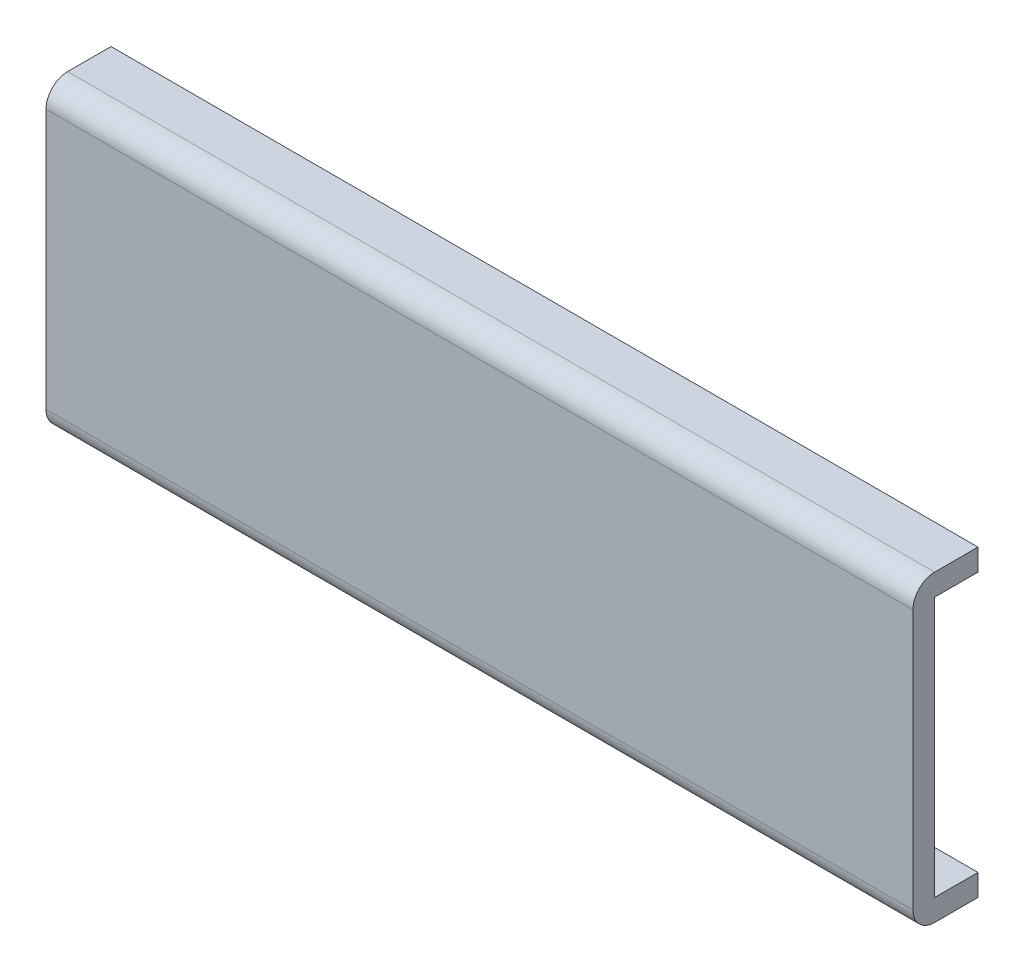
ISO-10303-21;
HEADER;
FILE_DESCRIPTION(('STEP AP214'),'2;1');
FILE_NAME('part.step','',(''),(''),'','','');
FILE_SCHEMA(('AUTOMOTIVE_DESIGN { 1 0 10303 214 1 1 1 1 }'));
ENDSEC;
DATA;
#1=APPLICATION_CONTEXT('core data for automotive mechanical design processes');
#2=APPLICATION_PROTOCOL_DEFINITION('international standard','automotive_design',2000,#1);
#3=PRODUCT_CONTEXT('',#1,'mechanical');
#4=PRODUCT('Part','Part','',(#3));
#5=PRODUCT_RELATED_PRODUCT_CATEGORY('part','',(#4));
#6=PRODUCT_DEFINITION_FORMATION('','',#4);
#7=PRODUCT_DEFINITION_CONTEXT('part definition',#1,'design');
#8=PRODUCT_DEFINITION('design','',#6,#7);
#9=PRODUCT_DEFINITION_SHAPE('','',#8);
#10=(LENGTH_UNIT() NAMED_UNIT(*) SI_UNIT(.MILLI.,.METRE.));
#11=(NAMED_UNIT(*) PLANE_ANGLE_UNIT() SI_UNIT($,.RADIAN.));
#12=(NAMED_UNIT(*) SI_UNIT($,.STERADIAN.) SOLID_ANGLE_UNIT());
#13=UNCERTAINTY_MEASURE_WITH_UNIT(LENGTH_MEASURE(1.E-05),#10,'distance_accuracy_value','');
#14=(GEOMETRIC_REPRESENTATION_CONTEXT(3) GLOBAL_UNCERTAINTY_ASSIGNED_CONTEXT((#13)) GLOBAL_UNIT_ASSIGNED_CONTEXT((#10,
#11,#12)) REPRESENTATION_CONTEXT('',''));
#15=CARTESIAN_POINT('',(0.,0.,0.));
#16=DIRECTION('',(0.,0.,1.));
#17=DIRECTION('',(1.,0.,0.));
#18=AXIS2_PLACEMENT_3D('',#15,#16,#17);
#19=CARTESIAN_POINT('',(30.4772096364507,32.496960400241,-14.9568528181353));
#20=DIRECTION('',(-1.,0.,0.));
#21=DIRECTION('',(0.,0.,1.));
#22=AXIS2_PLACEMENT_3D('',#19,#20,#21);
#23=CYLINDRICAL_SURFACE('',#22,1.);
#24=CARTESIAN_POINT('',(50.4772096364506,32.496960400241,-14.9568528181353));
#25=DIRECTION('',(1.,0.,0.));
#26=DIRECTION('',(0.,1.,0.));
#27=AXIS2_PLACEMENT_3D('',#24,#25,#26);
#28=CIRCLE('',#27,1.);
#29=CARTESIAN_POINT('',(50.4772096364506,33.496960400241,-14.9568528181353));
#30=VERTEX_POINT('',#29);
#31=CARTESIAN_POINT('',(50.4772096364506,32.496960400241,-13.9568528181353));
#32=VERTEX_POINT('',#31);
#33=EDGE_CURVE('E185',#30,#32,#28,.T.);
#34=ORIENTED_EDGE('',*,*,#33,.F.);
#35=DIRECTION('',(1.,0.,0.));
#36=VECTOR('',#35,1.);
#37=CARTESIAN_POINT('',(50.4772096364506,33.496960400241,-14.9568528181353));
#38=LINE('',#37,#36);
#39=CARTESIAN_POINT('',(10.4772096364506,33.496960400241,-14.9568528181353));
#40=VERTEX_POINT('',#39);
#41=EDGE_CURVE('E205',#40,#30,#38,.T.);
#42=ORIENTED_EDGE('',*,*,#41,.F.);
#43=CARTESIAN_POINT('',(10.4772096364506,32.496960400241,-14.9568528181353));
#44=DIRECTION('',(-1.,0.,0.));
#45=DIRECTION('',(0.,0.,1.));
#46=AXIS2_PLACEMENT_3D('',#43,#44,#45);
#47=CIRCLE('',#46,1.);
#48=CARTESIAN_POINT('',(10.4772096364506,32.496960400241,-13.9568528181353));
#49=VERTEX_POINT('',#48);
#50=EDGE_CURVE('E146',#49,#40,#47,.T.);
#51=ORIENTED_EDGE('',*,*,#50,.F.);
#52=DIRECTION('',(-1.,0.,0.));
#53=VECTOR('',#52,1.);
#54=CARTESIAN_POINT('',(50.4772096364506,32.496960400241,-13.9568528181353));
#55=LINE('',#54,#53);
#56=EDGE_CURVE('E137',#32,#49,#55,.T.);
#57=ORIENTED_EDGE('',*,*,#56,.F.);
#58=EDGE_LOOP('',(#34,#42,#51,#57));
#59=FACE_BOUND('',#58,.T.);
#60=ADVANCED_FACE('F17',(#59),#23,.T.);
#61=CARTESIAN_POINT('',(30.4772096364507,20.496960400241,-14.9568528181353));
#62=DIRECTION('',(1.,0.,0.));
#63=DIRECTION('',(0.,0.,-1.));
#64=AXIS2_PLACEMENT_3D('',#61,#62,#63);
#65=CYLINDRICAL_SURFACE('',#64,1.);
#66=CARTESIAN_POINT('',(10.4772096364506,20.496960400241,-14.9568528181353));
#67=DIRECTION('',(-1.,0.,0.));
#68=DIRECTION('',(0.,0.,1.));
#69=AXIS2_PLACEMENT_3D('',#66,#67,#68);
#70=CIRCLE('',#69,1.);
#71=CARTESIAN_POINT('',(10.4772096364506,19.496960400241,-14.9568528181353));
#72=VERTEX_POINT('',#71);
#73=CARTESIAN_POINT('',(10.4772096364506,20.496960400241,-13.9568528181353));
#74=VERTEX_POINT('',#73);
#75=EDGE_CURVE('E122',#72,#74,#70,.T.);
#76=ORIENTED_EDGE('',*,*,#75,.F.);
#77=DIRECTION('',(-1.,0.,0.));
#78=VECTOR('',#77,1.);
#79=CARTESIAN_POINT('',(10.4772096364506,19.496960400241,-14.9568528181353));
#80=LINE('',#79,#78);
#81=CARTESIAN_POINT('',(50.4772096364506,19.496960400241,-14.9568528181353));
#82=VERTEX_POINT('',#81);
#83=EDGE_CURVE('E21',#82,#72,#80,.T.);
#84=ORIENTED_EDGE('',*,*,#83,.F.);
#85=CARTESIAN_POINT('',(50.4772096364506,20.496960400241,-14.9568528181353));
#86=DIRECTION('',(1.,0.,0.));
#87=DIRECTION('',(0.,1.,0.));
#88=AXIS2_PLACEMENT_3D('',#85,#86,#87);
#89=CIRCLE('',#88,1.);
#90=CARTESIAN_POINT('',(50.4772096364506,20.496960400241,-13.9568528181353));
#91=VERTEX_POINT('',#90);
#92=EDGE_CURVE('E134',#91,#82,#89,.T.);
#93=ORIENTED_EDGE('',*,*,#92,.F.);
#94=DIRECTION('',(1.,0.,0.));
#95=VECTOR('',#94,1.);
#96=CARTESIAN_POINT('',(10.4772096364506,20.496960400241,-13.9568528181353));
#97=LINE('',#96,#95);
#98=EDGE_CURVE('E80',#74,#91,#97,.T.);
#99=ORIENTED_EDGE('',*,*,#98,.F.);
#100=EDGE_LOOP('',(#76,#84,#93,#99));
#101=FACE_BOUND('',#100,.T.);
#102=ADVANCED_FACE('F19',(#101),#65,.T.);
#103=CARTESIAN_POINT('',(30.4772096364507,26.496960400241,-16.9568528181352));
#104=DIRECTION('',(0.,0.,1.));
#105=DIRECTION('',(1.,0.,0.));
#106=AXIS2_PLACEMENT_3D('',#103,#104,#105);
#107=PLANE('',#106);
#108=DIRECTION('',(0.,-1.,0.));
#109=VECTOR('',#108,1.);
#110=CARTESIAN_POINT('',(50.4772096364506,20.496960400241,-16.9568528181352));
#111=LINE('',#110,#109);
#112=CARTESIAN_POINT('',(50.4772096364506,20.496960400241,-16.9568528181352));
#113=VERTEX_POINT('',#112);
#114=CARTESIAN_POINT('',(50.4772096364506,19.496960400241,-16.9568528181352));
#115=VERTEX_POINT('',#114);
#116=EDGE_CURVE('E168',#113,#115,#111,.T.);
#117=ORIENTED_EDGE('',*,*,#116,.T.);
#118=DIRECTION('',(-1.,0.,0.));
#119=VECTOR('',#118,1.);
#120=CARTESIAN_POINT('',(50.4772096364506,19.496960400241,-16.9568528181352));
#121=LINE('',#120,#119);
#122=CARTESIAN_POINT('',(10.4772096364506,19.496960400241,-16.9568528181352));
#123=VERTEX_POINT('',#122);
#124=EDGE_CURVE('E153',#115,#123,#121,.T.);
#125=ORIENTED_EDGE('',*,*,#124,.T.);
#126=DIRECTION('',(0.,1.,0.));
#127=VECTOR('',#126,1.);
#128=CARTESIAN_POINT('',(10.4772096364506,19.496960400241,-16.9568528181352));
#129=LINE('',#128,#127);
#130=CARTESIAN_POINT('',(10.4772096364506,20.496960400241,-16.9568528181352));
#131=VERTEX_POINT('',#130);
#132=EDGE_CURVE('E130',#123,#131,#129,.T.);
#133=ORIENTED_EDGE('',*,*,#132,.T.);
#134=DIRECTION('',(1.,0.,0.));
#135=VECTOR('',#134,1.);
#136=CARTESIAN_POINT('',(10.4772096364506,20.496960400241,-16.9568528181352));
#137=LINE('',#136,#135);
#138=EDGE_CURVE('E11',#131,#113,#137,.T.);
#139=ORIENTED_EDGE('',*,*,#138,.T.);
#140=EDGE_LOOP('',(#117,#125,#133,#139));
#141=FACE_BOUND('',#140,.T.);
#142=ADVANCED_FACE('F324',(#141),#107,.F.);
#143=CARTESIAN_POINT('',(50.4772096364506,20.496960400241,-16.9568528181352));
#144=DIRECTION('',(0.,-1.,0.));
#145=DIRECTION('',(0.,0.,-1.));
#146=AXIS2_PLACEMENT_3D('',#143,#144,#145);
#147=PLANE('',#146);
#148=DIRECTION('',(1.,0.,0.));
#149=VECTOR('',#148,1.);
#150=CARTESIAN_POINT('',(10.4772096364506,20.496960400241,-14.9568528181353));
#151=LINE('',#150,#149);
#152=CARTESIAN_POINT('',(10.4772096364506,20.496960400241,-14.9568528181353));
#153=VERTEX_POINT('',#152);
#154=CARTESIAN_POINT('',(50.4772096364506,20.496960400241,-14.9568528181353));
#155=VERTEX_POINT('',#154);
#156=EDGE_CURVE('E197',#153,#155,#151,.T.);
#157=ORIENTED_EDGE('',*,*,#156,.T.);
#158=DIRECTION('',(0.,0.,1.));
#159=VECTOR('',#158,1.);
#160=CARTESIAN_POINT('',(50.4772096364506,20.496960400241,-16.9568528181352));
#161=LINE('',#160,#159);
#162=EDGE_CURVE('E172',#113,#155,#161,.T.);
#163=ORIENTED_EDGE('',*,*,#162,.F.);
#164=ORIENTED_EDGE('',*,*,#138,.F.);
#165=DIRECTION('',(0.,0.,1.));
#166=VECTOR('',#165,1.);
#167=CARTESIAN_POINT('',(10.4772096364506,20.496960400241,-16.9568528181352));
#168=LINE('',#167,#166);
#169=EDGE_CURVE('E162',#131,#153,#168,.T.);
#170=ORIENTED_EDGE('',*,*,#169,.T.);
#171=EDGE_LOOP('',(#157,#163,#164,#170));
#172=FACE_BOUND('',#171,.T.);
#173=ADVANCED_FACE('F329',(#172),#147,.F.);
#174=CARTESIAN_POINT('',(30.4772096364507,26.496960400241,-16.9568528181352));
#175=DIRECTION('',(0.,0.,-1.));
#176=DIRECTION('',(0.,-1.,0.));
#177=AXIS2_PLACEMENT_3D('',#174,#175,#176);
#178=PLANE('',#177);
#179=DIRECTION('',(0.,-1.,0.));
#180=VECTOR('',#179,1.);
#181=CARTESIAN_POINT('',(50.4772096364506,33.496960400241,-16.9568528181352));
#182=LINE('',#181,#180);
#183=CARTESIAN_POINT('',(50.4772096364506,33.496960400241,-16.9568528181352));
#184=VERTEX_POINT('',#183);
#185=CARTESIAN_POINT('',(50.4772096364506,32.496960400241,-16.9568528181352));
#186=VERTEX_POINT('',#185);
#187=EDGE_CURVE('E174',#184,#186,#182,.T.);
#188=ORIENTED_EDGE('',*,*,#187,.T.);
#189=DIRECTION('',(-1.,0.,0.));
#190=VECTOR('',#189,1.);
#191=CARTESIAN_POINT('',(50.4772096364506,32.496960400241,-16.9568528181352));
#192=LINE('',#191,#190);
#193=CARTESIAN_POINT('',(10.4772096364506,32.496960400241,-16.9568528181352));
#194=VERTEX_POINT('',#193);
#195=EDGE_CURVE('E28',#186,#194,#192,.T.);
#196=ORIENTED_EDGE('',*,*,#195,.T.);
#197=DIRECTION('',(0.,1.,0.));
#198=VECTOR('',#197,1.);
#199=CARTESIAN_POINT('',(10.4772096364506,32.496960400241,-16.9568528181352));
#200=LINE('',#199,#198);
#201=CARTESIAN_POINT('',(10.4772096364506,33.496960400241,-16.9568528181352));
#202=VERTEX_POINT('',#201);
#203=EDGE_CURVE('E176',#194,#202,#200,.T.);
#204=ORIENTED_EDGE('',*,*,#203,.T.);
#205=DIRECTION('',(1.,0.,0.));
#206=VECTOR('',#205,1.);
#207=CARTESIAN_POINT('',(10.4772096364506,33.496960400241,-16.9568528181352));
#208=LINE('',#207,#206);
#209=EDGE_CURVE('E138',#202,#184,#208,.T.);
#210=ORIENTED_EDGE('',*,*,#209,.T.);
#211=EDGE_LOOP('',(#188,#196,#204,#210));
#212=FACE_BOUND('',#211,.T.);
#213=ADVANCED_FACE('F239',(#212),#178,.T.);
#214=CARTESIAN_POINT('',(50.4772096364506,32.496960400241,-16.9568528181352));
#215=DIRECTION('',(0.,1.,0.));
#216=DIRECTION('',(1.,0.,0.));
#217=AXIS2_PLACEMENT_3D('',#214,#215,#216);
#218=PLANE('',#217);
#219=DIRECTION('',(-1.,0.,0.));
#220=VECTOR('',#219,1.);
#221=CARTESIAN_POINT('',(50.4772096364506,32.496960400241,-14.9568528181353));
#222=LINE('',#221,#220);
#223=CARTESIAN_POINT('',(50.4772096364506,32.496960400241,-14.9568528181353));
#224=VERTEX_POINT('',#223);
#225=CARTESIAN_POINT('',(10.4772096364506,32.496960400241,-14.9568528181353));
#226=VERTEX_POINT('',#225);
#227=EDGE_CURVE('E192',#224,#226,#222,.T.);
#228=ORIENTED_EDGE('',*,*,#227,.T.);
#229=DIRECTION('',(0.,0.,1.));
#230=VECTOR('',#229,1.);
#231=CARTESIAN_POINT('',(10.4772096364506,32.496960400241,-16.9568528181352));
#232=LINE('',#231,#230);
#233=EDGE_CURVE('E180',#194,#226,#232,.T.);
#234=ORIENTED_EDGE('',*,*,#233,.F.);
#235=ORIENTED_EDGE('',*,*,#195,.F.);
#236=DIRECTION('',(0.,0.,1.));
#237=VECTOR('',#236,1.);
#238=CARTESIAN_POINT('',(50.4772096364506,32.496960400241,-16.9568528181352));
#239=LINE('',#238,#237);
#240=EDGE_CURVE('E96',#186,#224,#239,.T.);
#241=ORIENTED_EDGE('',*,*,#240,.T.);
#242=EDGE_LOOP('',(#228,#234,#235,#241));
#243=FACE_BOUND('',#242,.T.);
#244=ADVANCED_FACE('F243',(#243),#218,.F.);
#245=CARTESIAN_POINT('',(30.4772096364507,26.496960400241,-13.9568528181353));
#246=DIRECTION('',(0.,0.,1.));
#247=DIRECTION('',(1.,0.,0.));
#248=AXIS2_PLACEMENT_3D('',#245,#246,#247);
#249=PLANE('',#248);
#250=DIRECTION('',(0.,-1.,0.));
#251=VECTOR('',#250,1.);
#252=CARTESIAN_POINT('',(10.4772096364506,32.496960400241,-13.9568528181353));
#253=LINE('',#252,#251);
#254=EDGE_CURVE('E141',#49,#74,#253,.T.);
#255=ORIENTED_EDGE('',*,*,#254,.T.);
#256=ORIENTED_EDGE('',*,*,#98,.T.);
#257=DIRECTION('',(0.,1.,0.));
#258=VECTOR('',#257,1.);
#259=CARTESIAN_POINT('',(50.4772096364506,20.496960400241,-13.9568528181353));
#260=LINE('',#259,#258);
#261=EDGE_CURVE('E167',#91,#32,#260,.T.);
#262=ORIENTED_EDGE('',*,*,#261,.T.);
#263=ORIENTED_EDGE('',*,*,#56,.T.);
#264=EDGE_LOOP('',(#255,#256,#262,#263));
#265=FACE_BOUND('',#264,.T.);
#266=ADVANCED_FACE('F142',(#265),#249,.T.);
#267=CARTESIAN_POINT('',(10.4772096364506,33.496960400241,-14.9568528181353));
#268=DIRECTION('',(0.,1.,0.));
#269=DIRECTION('',(1.,0.,0.));
#270=AXIS2_PLACEMENT_3D('',#267,#268,#269);
#271=PLANE('',#270);
#272=DIRECTION('',(0.,0.,1.));
#273=VECTOR('',#272,1.);
#274=CARTESIAN_POINT('',(10.4772096364506,33.496960400241,-16.9568528181352));
#275=LINE('',#274,#273);
#276=EDGE_CURVE('E181',#202,#40,#275,.T.);
#277=ORIENTED_EDGE('',*,*,#276,.T.);
#278=ORIENTED_EDGE('',*,*,#41,.T.);
#279=DIRECTION('',(0.,0.,1.));
#280=VECTOR('',#279,1.);
#281=CARTESIAN_POINT('',(50.4772096364506,33.496960400241,-16.9568528181352));
#282=LINE('',#281,#280);
#283=EDGE_CURVE('E182',#184,#30,#282,.T.);
#284=ORIENTED_EDGE('',*,*,#283,.F.);
#285=ORIENTED_EDGE('',*,*,#209,.F.);
#286=EDGE_LOOP('',(#277,#278,#284,#285));
#287=FACE_BOUND('',#286,.T.);
#288=ADVANCED_FACE('F230',(#287),#271,.T.);
#289=CARTESIAN_POINT('',(10.4772096364506,33.496960400241,-14.9568528181353));
#290=DIRECTION('',(-1.,0.,0.));
#291=DIRECTION('',(0.,0.,1.));
#292=AXIS2_PLACEMENT_3D('',#289,#290,#291);
#293=PLANE('',#292);
#294=DIRECTION('',(0.,0.,1.));
#295=VECTOR('',#294,1.);
#296=CARTESIAN_POINT('',(10.4772096364506,19.496960400241,-16.9568528181352));
#297=LINE('',#296,#295);
#298=EDGE_CURVE('E150',#123,#72,#297,.T.);
#299=ORIENTED_EDGE('',*,*,#298,.T.);
#300=ORIENTED_EDGE('',*,*,#75,.T.);
#301=ORIENTED_EDGE('',*,*,#254,.F.);
#302=ORIENTED_EDGE('',*,*,#50,.T.);
#303=ORIENTED_EDGE('',*,*,#276,.F.);
#304=ORIENTED_EDGE('',*,*,#203,.F.);
#305=ORIENTED_EDGE('',*,*,#233,.T.);
#306=DIRECTION('',(0.,-1.,0.));
#307=VECTOR('',#306,1.);
#308=CARTESIAN_POINT('',(10.4772096364506,32.496960400241,-14.9568528181353));
#309=LINE('',#308,#307);
#310=EDGE_CURVE('E193',#226,#153,#309,.T.);
#311=ORIENTED_EDGE('',*,*,#310,.T.);
#312=ORIENTED_EDGE('',*,*,#169,.F.);
#313=ORIENTED_EDGE('',*,*,#132,.F.);
#314=EDGE_LOOP('',(#299,#300,#301,#302,#303,#304,#305,#311,#312,#313));
#315=FACE_BOUND('',#314,.T.);
#316=ADVANCED_FACE('F148',(#315),#293,.T.);
#317=CARTESIAN_POINT('',(10.4772096364506,19.496960400241,-14.9568528181353));
#318=DIRECTION('',(0.,-1.,0.));
#319=DIRECTION('',(0.,0.,-1.));
#320=AXIS2_PLACEMENT_3D('',#317,#318,#319);
#321=PLANE('',#320);
#322=DIRECTION('',(0.,0.,1.));
#323=VECTOR('',#322,1.);
#324=CARTESIAN_POINT('',(50.4772096364506,19.496960400241,-16.9568528181352));
#325=LINE('',#324,#323);
#326=EDGE_CURVE('E166',#115,#82,#325,.T.);
#327=ORIENTED_EDGE('',*,*,#326,.T.);
#328=ORIENTED_EDGE('',*,*,#83,.T.);
#329=ORIENTED_EDGE('',*,*,#298,.F.);
#330=ORIENTED_EDGE('',*,*,#124,.F.);
#331=EDGE_LOOP('',(#327,#328,#329,#330));
#332=FACE_BOUND('',#331,.T.);
#333=ADVANCED_FACE('F358',(#332),#321,.T.);
#334=CARTESIAN_POINT('',(50.4772096364506,33.496960400241,-14.9568528181353));
#335=DIRECTION('',(1.,0.,0.));
#336=DIRECTION('',(0.,-1.,0.));
#337=AXIS2_PLACEMENT_3D('',#334,#335,#336);
#338=PLANE('',#337);
#339=ORIENTED_EDGE('',*,*,#261,.F.);
#340=ORIENTED_EDGE('',*,*,#92,.T.);
#341=ORIENTED_EDGE('',*,*,#326,.F.);
#342=ORIENTED_EDGE('',*,*,#116,.F.);
#343=ORIENTED_EDGE('',*,*,#162,.T.);
#344=DIRECTION('',(0.,1.,0.));
#345=VECTOR('',#344,1.);
#346=CARTESIAN_POINT('',(50.4772096364506,20.496960400241,-14.9568528181353));
#347=LINE('',#346,#345);
#348=EDGE_CURVE('E189',#155,#224,#347,.T.);
#349=ORIENTED_EDGE('',*,*,#348,.T.);
#350=ORIENTED_EDGE('',*,*,#240,.F.);
#351=ORIENTED_EDGE('',*,*,#187,.F.);
#352=ORIENTED_EDGE('',*,*,#283,.T.);
#353=ORIENTED_EDGE('',*,*,#33,.T.);
#354=EDGE_LOOP('',(#339,#340,#341,#342,#343,#349,#350,#351,#352,#353));
#355=FACE_BOUND('',#354,.T.);
#356=ADVANCED_FACE('F237',(#355),#338,.T.);
#357=CARTESIAN_POINT('',(30.4772096364507,26.496960400241,-14.9568528181353));
#358=DIRECTION('',(0.,0.,1.));
#359=DIRECTION('',(1.,0.,0.));
#360=AXIS2_PLACEMENT_3D('',#357,#358,#359);
#361=PLANE('',#360);
#362=ORIENTED_EDGE('',*,*,#156,.F.);
#363=ORIENTED_EDGE('',*,*,#310,.F.);
#364=ORIENTED_EDGE('',*,*,#227,.F.);
#365=ORIENTED_EDGE('',*,*,#348,.F.);
#366=EDGE_LOOP('',(#362,#363,#364,#365));
#367=FACE_BOUND('',#366,.T.);
#368=ADVANCED_FACE('F250',(#367),#361,.F.);
#369=CLOSED_SHELL('',(#60,#102,#142,#173,#213,#244,#266,#288,#316,#333,#356,#368));
#370=MANIFOLD_SOLID_BREP('B1',#369);
#371=ADVANCED_BREP_SHAPE_REPRESENTATION('',(#18,#370),#14);
#372=SHAPE_DEFINITION_REPRESENTATION(#9,#371);
ENDSEC;
END-ISO-10303-21;
